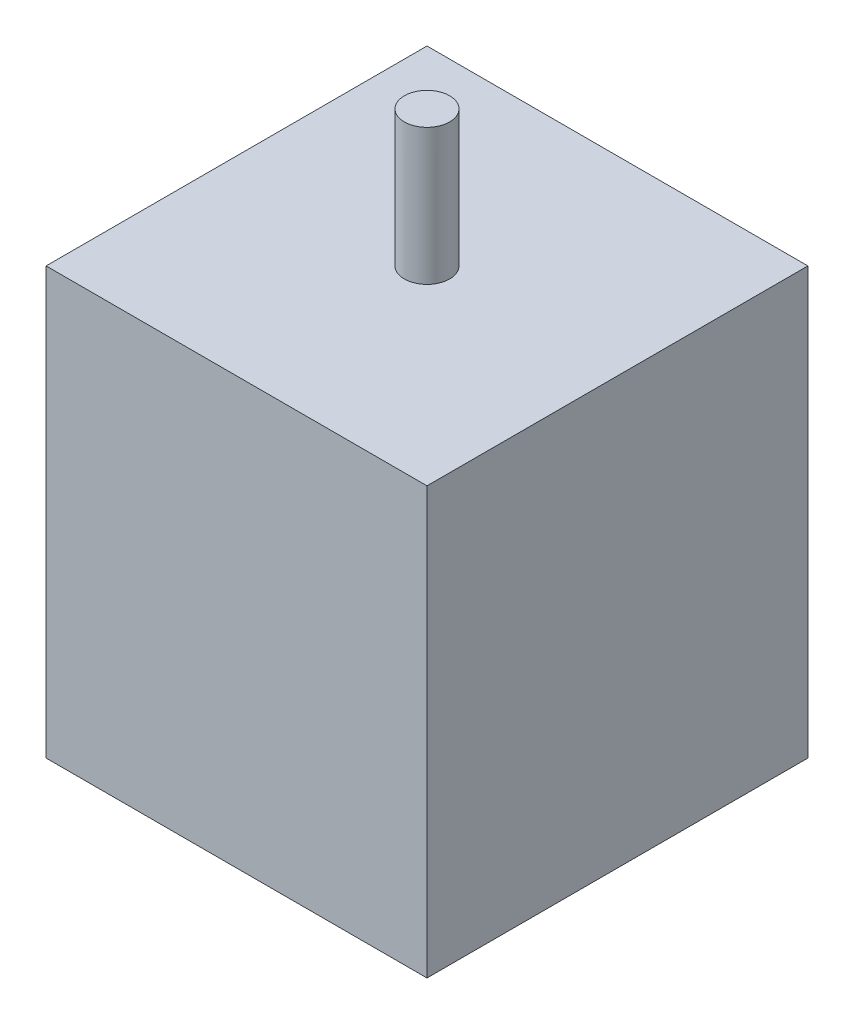
ISO-10303-21;
HEADER;
FILE_DESCRIPTION(('STEP AP214'),'2;1');
FILE_NAME('part.step','',(''),(''),'','','');
FILE_SCHEMA(('AUTOMOTIVE_DESIGN { 1 0 10303 214 1 1 1 1 }'));
ENDSEC;
DATA;
#1=APPLICATION_CONTEXT('core data for automotive mechanical design processes');
#2=APPLICATION_PROTOCOL_DEFINITION('international standard','automotive_design',2000,#1);
#3=PRODUCT_CONTEXT('',#1,'mechanical');
#4=PRODUCT('Part','Part','',(#3));
#5=PRODUCT_RELATED_PRODUCT_CATEGORY('part','',(#4));
#6=PRODUCT_DEFINITION_FORMATION('','',#4);
#7=PRODUCT_DEFINITION_CONTEXT('part definition',#1,'design');
#8=PRODUCT_DEFINITION('design','',#6,#7);
#9=PRODUCT_DEFINITION_SHAPE('','',#8);
#10=(LENGTH_UNIT() NAMED_UNIT(*) SI_UNIT(.MILLI.,.METRE.));
#11=(NAMED_UNIT(*) PLANE_ANGLE_UNIT() SI_UNIT($,.RADIAN.));
#12=(NAMED_UNIT(*) SI_UNIT($,.STERADIAN.) SOLID_ANGLE_UNIT());
#13=UNCERTAINTY_MEASURE_WITH_UNIT(LENGTH_MEASURE(1.E-05),#10,'distance_accuracy_value','');
#14=(GEOMETRIC_REPRESENTATION_CONTEXT(3) GLOBAL_UNCERTAINTY_ASSIGNED_CONTEXT((#13)) GLOBAL_UNIT_ASSIGNED_CONTEXT((#10,
#11,#12)) REPRESENTATION_CONTEXT('',''));
#15=CARTESIAN_POINT('',(0.,0.,0.));
#16=DIRECTION('',(0.,0.,1.));
#17=DIRECTION('',(1.,0.,0.));
#18=AXIS2_PLACEMENT_3D('',#15,#16,#17);
#19=CARTESIAN_POINT('',(0.,47.,0.));
#20=DIRECTION('',(0.,-1.,0.));
#21=DIRECTION('',(0.,0.,-1.));
#22=AXIS2_PLACEMENT_3D('',#19,#20,#21);
#23=PLANE('',#22);
#24=DIRECTION('',(0.,0.,1.));
#25=VECTOR('',#24,1.);
#26=CARTESIAN_POINT('',(0.,47.,0.));
#27=LINE('',#26,#25);
#28=CARTESIAN_POINT('',(0.,47.,-42.));
#29=VERTEX_POINT('',#28);
#30=CARTESIAN_POINT('',(0.,47.,0.));
#31=VERTEX_POINT('',#30);
#32=EDGE_CURVE('E86',#29,#31,#27,.T.);
#33=ORIENTED_EDGE('',*,*,#32,.T.);
#34=DIRECTION('',(1.,0.,0.));
#35=VECTOR('',#34,1.);
#36=CARTESIAN_POINT('',(0.,47.,0.));
#37=LINE('',#36,#35);
#38=CARTESIAN_POINT('',(42.,47.,0.));
#39=VERTEX_POINT('',#38);
#40=EDGE_CURVE('E81',#31,#39,#37,.T.);
#41=ORIENTED_EDGE('',*,*,#40,.T.);
#42=DIRECTION('',(0.,0.,-1.));
#43=VECTOR('',#42,1.);
#44=CARTESIAN_POINT('',(42.,47.,0.));
#45=LINE('',#44,#43);
#46=CARTESIAN_POINT('',(42.,47.,-42.));
#47=VERTEX_POINT('',#46);
#48=EDGE_CURVE('E84',#39,#47,#45,.T.);
#49=ORIENTED_EDGE('',*,*,#48,.T.);
#50=DIRECTION('',(-1.,0.,0.));
#51=VECTOR('',#50,1.);
#52=CARTESIAN_POINT('',(0.,47.,-42.));
#53=LINE('',#52,#51);
#54=EDGE_CURVE('E50',#47,#29,#53,.T.);
#55=ORIENTED_EDGE('',*,*,#54,.T.);
#56=EDGE_LOOP('',(#33,#41,#49,#55));
#57=FACE_BOUND('',#56,.T.);
#58=CARTESIAN_POINT('',(21.,47.,-21.));
#59=DIRECTION('',(0.,-1.,0.));
#60=DIRECTION('',(0.,0.,-1.));
#61=AXIS2_PLACEMENT_3D('',#58,#59,#60);
#62=CIRCLE('',#61,2.5);
#63=CARTESIAN_POINT('',(21.,47.,-23.5));
#64=VERTEX_POINT('',#63);
#65=EDGE_CURVE('E11',#64,#64,#62,.F.);
#66=ORIENTED_EDGE('',*,*,#65,.F.);
#67=EDGE_LOOP('',(#66));
#68=FACE_BOUND('',#67,.T.);
#69=ADVANCED_FACE('F33',(#57,#68),#23,.F.);
#70=CARTESIAN_POINT('',(0.,47.,0.));
#71=DIRECTION('',(1.,0.,0.));
#72=DIRECTION('',(0.,0.,-1.));
#73=AXIS2_PLACEMENT_3D('',#70,#71,#72);
#74=PLANE('',#73);
#75=DIRECTION('',(0.,0.,1.));
#76=VECTOR('',#75,1.);
#77=CARTESIAN_POINT('',(0.,0.,0.));
#78=LINE('',#77,#76);
#79=CARTESIAN_POINT('',(0.,0.,-42.));
#80=VERTEX_POINT('',#79);
#81=CARTESIAN_POINT('',(0.,0.,0.));
#82=VERTEX_POINT('',#81);
#83=EDGE_CURVE('E100',#80,#82,#78,.T.);
#84=ORIENTED_EDGE('',*,*,#83,.T.);
#85=DIRECTION('',(0.,-1.,0.));
#86=VECTOR('',#85,1.);
#87=CARTESIAN_POINT('',(0.,47.,0.));
#88=LINE('',#87,#86);
#89=EDGE_CURVE('E42',#31,#82,#88,.T.);
#90=ORIENTED_EDGE('',*,*,#89,.F.);
#91=ORIENTED_EDGE('',*,*,#32,.F.);
#92=DIRECTION('',(0.,-1.,0.));
#93=VECTOR('',#92,1.);
#94=CARTESIAN_POINT('',(0.,47.,-42.));
#95=LINE('',#94,#93);
#96=EDGE_CURVE('E96',#29,#80,#95,.T.);
#97=ORIENTED_EDGE('',*,*,#96,.T.);
#98=EDGE_LOOP('',(#84,#90,#91,#97));
#99=FACE_BOUND('',#98,.T.);
#100=ADVANCED_FACE('F35',(#99),#74,.F.);
#101=CARTESIAN_POINT('',(0.,47.,0.));
#102=DIRECTION('',(0.,0.,-1.));
#103=DIRECTION('',(-1.,0.,0.));
#104=AXIS2_PLACEMENT_3D('',#101,#102,#103);
#105=PLANE('',#104);
#106=DIRECTION('',(1.,0.,0.));
#107=VECTOR('',#106,1.);
#108=CARTESIAN_POINT('',(0.,0.,0.));
#109=LINE('',#108,#107);
#110=CARTESIAN_POINT('',(42.,0.,0.));
#111=VERTEX_POINT('',#110);
#112=EDGE_CURVE('E91',#82,#111,#109,.T.);
#113=ORIENTED_EDGE('',*,*,#112,.T.);
#114=DIRECTION('',(0.,-1.,0.));
#115=VECTOR('',#114,1.);
#116=CARTESIAN_POINT('',(42.,47.,0.));
#117=LINE('',#116,#115);
#118=EDGE_CURVE('E89',#39,#111,#117,.T.);
#119=ORIENTED_EDGE('',*,*,#118,.F.);
#120=ORIENTED_EDGE('',*,*,#40,.F.);
#121=ORIENTED_EDGE('',*,*,#89,.T.);
#122=EDGE_LOOP('',(#113,#119,#120,#121));
#123=FACE_BOUND('',#122,.T.);
#124=ADVANCED_FACE('F90',(#123),#105,.F.);
#125=CARTESIAN_POINT('',(42.,47.,0.));
#126=DIRECTION('',(-1.,0.,0.));
#127=DIRECTION('',(0.,0.,1.));
#128=AXIS2_PLACEMENT_3D('',#125,#126,#127);
#129=PLANE('',#128);
#130=DIRECTION('',(0.,0.,-1.));
#131=VECTOR('',#130,1.);
#132=CARTESIAN_POINT('',(42.,0.,0.));
#133=LINE('',#132,#131);
#134=CARTESIAN_POINT('',(42.,0.,-42.));
#135=VERTEX_POINT('',#134);
#136=EDGE_CURVE('E67',#111,#135,#133,.T.);
#137=ORIENTED_EDGE('',*,*,#136,.T.);
#138=DIRECTION('',(0.,-1.,0.));
#139=VECTOR('',#138,1.);
#140=CARTESIAN_POINT('',(42.,47.,-42.));
#141=LINE('',#140,#139);
#142=EDGE_CURVE('E92',#47,#135,#141,.T.);
#143=ORIENTED_EDGE('',*,*,#142,.F.);
#144=ORIENTED_EDGE('',*,*,#48,.F.);
#145=ORIENTED_EDGE('',*,*,#118,.T.);
#146=EDGE_LOOP('',(#137,#143,#144,#145));
#147=FACE_BOUND('',#146,.T.);
#148=ADVANCED_FACE('F94',(#147),#129,.F.);
#149=CARTESIAN_POINT('',(0.,47.,-42.));
#150=DIRECTION('',(0.,0.,1.));
#151=DIRECTION('',(1.,0.,0.));
#152=AXIS2_PLACEMENT_3D('',#149,#150,#151);
#153=PLANE('',#152);
#154=DIRECTION('',(-1.,0.,0.));
#155=VECTOR('',#154,1.);
#156=CARTESIAN_POINT('',(0.,0.,-42.));
#157=LINE('',#156,#155);
#158=EDGE_CURVE('E73',#135,#80,#157,.T.);
#159=ORIENTED_EDGE('',*,*,#158,.T.);
#160=ORIENTED_EDGE('',*,*,#96,.F.);
#161=ORIENTED_EDGE('',*,*,#54,.F.);
#162=ORIENTED_EDGE('',*,*,#142,.T.);
#163=EDGE_LOOP('',(#159,#160,#161,#162));
#164=FACE_BOUND('',#163,.T.);
#165=ADVANCED_FACE('F114',(#164),#153,.F.);
#166=CARTESIAN_POINT('',(0.,0.,0.));
#167=DIRECTION('',(0.,-1.,0.));
#168=DIRECTION('',(0.,0.,-1.));
#169=AXIS2_PLACEMENT_3D('',#166,#167,#168);
#170=PLANE('',#169);
#171=ORIENTED_EDGE('',*,*,#83,.F.);
#172=ORIENTED_EDGE('',*,*,#158,.F.);
#173=ORIENTED_EDGE('',*,*,#136,.F.);
#174=ORIENTED_EDGE('',*,*,#112,.F.);
#175=EDGE_LOOP('',(#171,#172,#173,#174));
#176=FACE_BOUND('',#175,.T.);
#177=ADVANCED_FACE('F111',(#176),#170,.T.);
#178=CARTESIAN_POINT('',(21.,62.,-21.));
#179=DIRECTION('',(0.,-1.,0.));
#180=DIRECTION('',(0.,0.,-1.));
#181=AXIS2_PLACEMENT_3D('',#178,#179,#180);
#182=CYLINDRICAL_SURFACE('',#181,2.5);
#183=CARTESIAN_POINT('',(21.,62.,-21.));
#184=DIRECTION('',(0.,1.,0.));
#185=DIRECTION('',(0.,0.,1.));
#186=AXIS2_PLACEMENT_3D('',#183,#184,#185);
#187=CIRCLE('',#186,2.5);
#188=CARTESIAN_POINT('',(21.,62.,-18.5));
#189=VERTEX_POINT('',#188);
#190=EDGE_CURVE('E103',#189,#189,#187,.T.);
#191=ORIENTED_EDGE('',*,*,#190,.F.);
#192=EDGE_LOOP('',(#191));
#193=FACE_BOUND('',#192,.T.);
#194=ORIENTED_EDGE('',*,*,#65,.T.);
#195=EDGE_LOOP('',(#194));
#196=FACE_BOUND('',#195,.T.);
#197=ADVANCED_FACE('F113',(#193,#196),#182,.T.);
#198=CARTESIAN_POINT('',(21.,62.,-21.));
#199=DIRECTION('',(0.,1.,0.));
#200=DIRECTION('',(0.,0.,1.));
#201=AXIS2_PLACEMENT_3D('',#198,#199,#200);
#202=PLANE('',#201);
#203=ORIENTED_EDGE('',*,*,#190,.T.);
#204=EDGE_LOOP('',(#203));
#205=FACE_BOUND('',#204,.T.);
#206=ADVANCED_FACE('F120',(#205),#202,.T.);
#207=CLOSED_SHELL('',(#69,#100,#124,#148,#165,#177,#197,#206));
#208=MANIFOLD_SOLID_BREP('B2',#207);
#209=ADVANCED_BREP_SHAPE_REPRESENTATION('',(#18,#208),#14);
#210=SHAPE_DEFINITION_REPRESENTATION(#9,#209);
ENDSEC;
END-ISO-10303-21;
